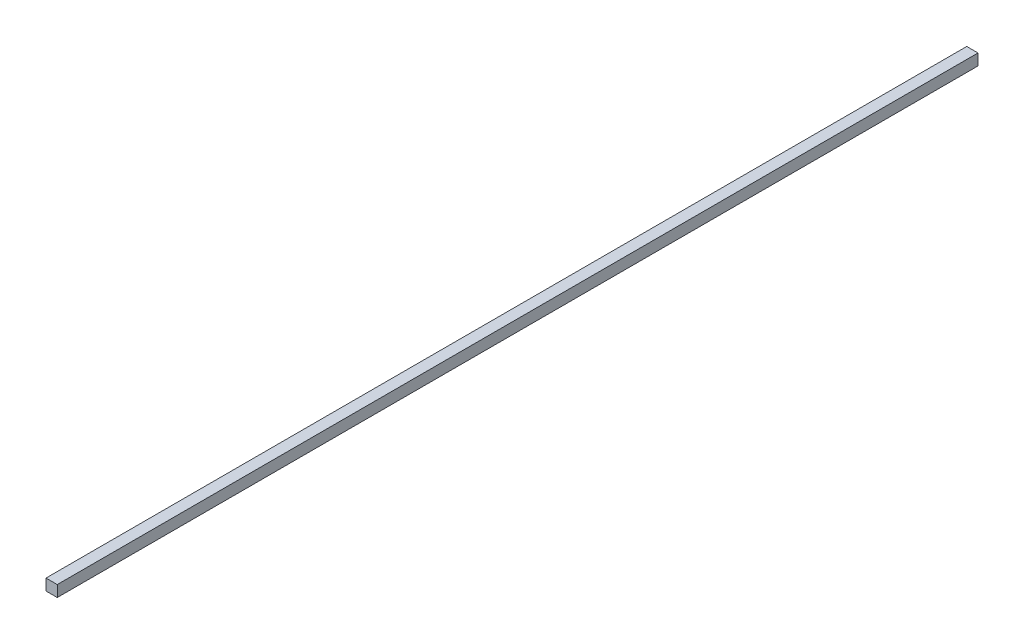
ISO-10303-21;
HEADER;
FILE_DESCRIPTION(('STEP AP214'),'2;1');
FILE_NAME('part.step','',(''),(''),'','','');
FILE_SCHEMA(('AUTOMOTIVE_DESIGN { 1 0 10303 214 1 1 1 1 }'));
ENDSEC;
DATA;
#1=APPLICATION_CONTEXT('core data for automotive mechanical design processes');
#2=APPLICATION_PROTOCOL_DEFINITION('international standard','automotive_design',2000,#1);
#3=PRODUCT_CONTEXT('',#1,'mechanical');
#4=PRODUCT('Part','Part','',(#3));
#5=PRODUCT_RELATED_PRODUCT_CATEGORY('part','',(#4));
#6=PRODUCT_DEFINITION_FORMATION('','',#4);
#7=PRODUCT_DEFINITION_CONTEXT('part definition',#1,'design');
#8=PRODUCT_DEFINITION('design','',#6,#7);
#9=PRODUCT_DEFINITION_SHAPE('','',#8);
#10=(LENGTH_UNIT() NAMED_UNIT(*) SI_UNIT(.MILLI.,.METRE.));
#11=(NAMED_UNIT(*) PLANE_ANGLE_UNIT() SI_UNIT($,.RADIAN.));
#12=(NAMED_UNIT(*) SI_UNIT($,.STERADIAN.) SOLID_ANGLE_UNIT());
#13=UNCERTAINTY_MEASURE_WITH_UNIT(LENGTH_MEASURE(1.E-05),#10,'distance_accuracy_value','');
#14=(GEOMETRIC_REPRESENTATION_CONTEXT(3) GLOBAL_UNCERTAINTY_ASSIGNED_CONTEXT((#13)) GLOBAL_UNIT_ASSIGNED_CONTEXT((#10,
#11,#12)) REPRESENTATION_CONTEXT('',''));
#15=CARTESIAN_POINT('',(0.,0.,0.));
#16=DIRECTION('',(0.,0.,1.));
#17=DIRECTION('',(1.,0.,0.));
#18=AXIS2_PLACEMENT_3D('',#15,#16,#17);
#19=CARTESIAN_POINT('',(6.35,0.,0.));
#20=DIRECTION('',(-1.,0.,0.));
#21=DIRECTION('',(0.,0.,1.));
#22=AXIS2_PLACEMENT_3D('',#19,#20,#21);
#23=PLANE('',#22);
#24=DIRECTION('',(0.,0.,1.));
#25=VECTOR('',#24,1.);
#26=CARTESIAN_POINT('',(6.35,6.35,259.75));
#27=LINE('',#26,#25);
#28=CARTESIAN_POINT('',(6.35,6.35,0.));
#29=VERTEX_POINT('',#28);
#30=CARTESIAN_POINT('',(6.35,6.35,519.5));
#31=VERTEX_POINT('',#30);
#32=EDGE_CURVE('E21',#29,#31,#27,.T.);
#33=ORIENTED_EDGE('',*,*,#32,.T.);
#34=DIRECTION('',(0.,-1.,0.));
#35=VECTOR('',#34,1.);
#36=CARTESIAN_POINT('',(6.35,3.175,519.5));
#37=LINE('',#36,#35);
#38=CARTESIAN_POINT('',(6.35,0.,519.5));
#39=VERTEX_POINT('',#38);
#40=EDGE_CURVE('E56',#31,#39,#37,.T.);
#41=ORIENTED_EDGE('',*,*,#40,.T.);
#42=DIRECTION('',(0.,0.,-1.));
#43=VECTOR('',#42,1.);
#44=CARTESIAN_POINT('',(6.35,0.,259.75));
#45=LINE('',#44,#43);
#46=CARTESIAN_POINT('',(6.35,0.,0.));
#47=VERTEX_POINT('',#46);
#48=EDGE_CURVE('E77',#39,#47,#45,.T.);
#49=ORIENTED_EDGE('',*,*,#48,.T.);
#50=DIRECTION('',(0.,-1.,0.));
#51=VECTOR('',#50,1.);
#52=CARTESIAN_POINT('',(6.35,3.175,0.));
#53=LINE('',#52,#51);
#54=EDGE_CURVE('E59',#29,#47,#53,.T.);
#55=ORIENTED_EDGE('',*,*,#54,.F.);
#56=EDGE_LOOP('',(#33,#41,#49,#55));
#57=FACE_BOUND('',#56,.T.);
#58=ADVANCED_FACE('F17',(#57),#23,.F.);
#59=CARTESIAN_POINT('',(0.,6.35,519.5));
#60=DIRECTION('',(0.,-1.,0.));
#61=DIRECTION('',(0.,0.,-1.));
#62=AXIS2_PLACEMENT_3D('',#59,#60,#61);
#63=PLANE('',#62);
#64=DIRECTION('',(0.,0.,1.));
#65=VECTOR('',#64,1.);
#66=CARTESIAN_POINT('',(0.,6.35,259.75));
#67=LINE('',#66,#65);
#68=CARTESIAN_POINT('',(0.,6.35,0.));
#69=VERTEX_POINT('',#68);
#70=CARTESIAN_POINT('',(0.,6.35,519.5));
#71=VERTEX_POINT('',#70);
#72=EDGE_CURVE('E74',#69,#71,#67,.T.);
#73=ORIENTED_EDGE('',*,*,#72,.T.);
#74=DIRECTION('',(1.,0.,0.));
#75=VECTOR('',#74,1.);
#76=CARTESIAN_POINT('',(3.175,6.35,519.5));
#77=LINE('',#76,#75);
#78=EDGE_CURVE('E64',#71,#31,#77,.T.);
#79=ORIENTED_EDGE('',*,*,#78,.T.);
#80=ORIENTED_EDGE('',*,*,#32,.F.);
#81=DIRECTION('',(1.,0.,0.));
#82=VECTOR('',#81,1.);
#83=CARTESIAN_POINT('',(3.175,6.35,0.));
#84=LINE('',#83,#82);
#85=EDGE_CURVE('E79',#69,#29,#84,.T.);
#86=ORIENTED_EDGE('',*,*,#85,.F.);
#87=EDGE_LOOP('',(#73,#79,#80,#86));
#88=FACE_BOUND('',#87,.T.);
#89=ADVANCED_FACE('F73',(#88),#63,.F.);
#90=CARTESIAN_POINT('',(6.35,0.,519.5));
#91=DIRECTION('',(0.,0.,-1.));
#92=DIRECTION('',(-1.,0.,0.));
#93=AXIS2_PLACEMENT_3D('',#90,#91,#92);
#94=PLANE('',#93);
#95=DIRECTION('',(1.,0.,0.));
#96=VECTOR('',#95,1.);
#97=CARTESIAN_POINT('',(3.175,0.,519.5));
#98=LINE('',#97,#96);
#99=CARTESIAN_POINT('',(0.,0.,519.5));
#100=VERTEX_POINT('',#99);
#101=EDGE_CURVE('E70',#100,#39,#98,.T.);
#102=ORIENTED_EDGE('',*,*,#101,.T.);
#103=ORIENTED_EDGE('',*,*,#40,.F.);
#104=ORIENTED_EDGE('',*,*,#78,.F.);
#105=DIRECTION('',(0.,-1.,0.));
#106=VECTOR('',#105,1.);
#107=CARTESIAN_POINT('',(0.,3.175,519.5));
#108=LINE('',#107,#106);
#109=EDGE_CURVE('E84',#71,#100,#108,.T.);
#110=ORIENTED_EDGE('',*,*,#109,.T.);
#111=EDGE_LOOP('',(#102,#103,#104,#110));
#112=FACE_BOUND('',#111,.T.);
#113=ADVANCED_FACE('F67',(#112),#94,.F.);
#114=CARTESIAN_POINT('',(0.,0.,0.));
#115=DIRECTION('',(0.,1.,0.));
#116=DIRECTION('',(0.,0.,1.));
#117=AXIS2_PLACEMENT_3D('',#114,#115,#116);
#118=PLANE('',#117);
#119=ORIENTED_EDGE('',*,*,#48,.F.);
#120=ORIENTED_EDGE('',*,*,#101,.F.);
#121=DIRECTION('',(0.,0.,-1.));
#122=VECTOR('',#121,1.);
#123=CARTESIAN_POINT('',(0.,0.,259.75));
#124=LINE('',#123,#122);
#125=CARTESIAN_POINT('',(0.,0.,0.));
#126=VERTEX_POINT('',#125);
#127=EDGE_CURVE('E27',#100,#126,#124,.T.);
#128=ORIENTED_EDGE('',*,*,#127,.T.);
#129=DIRECTION('',(-1.,0.,0.));
#130=VECTOR('',#129,1.);
#131=CARTESIAN_POINT('',(3.175,0.,0.));
#132=LINE('',#131,#130);
#133=EDGE_CURVE('E35',#47,#126,#132,.T.);
#134=ORIENTED_EDGE('',*,*,#133,.F.);
#135=EDGE_LOOP('',(#119,#120,#128,#134));
#136=FACE_BOUND('',#135,.T.);
#137=ADVANCED_FACE('F89',(#136),#118,.F.);
#138=CARTESIAN_POINT('',(6.35,0.,0.));
#139=DIRECTION('',(0.,0.,-1.));
#140=DIRECTION('',(-1.,0.,0.));
#141=AXIS2_PLACEMENT_3D('',#138,#139,#140);
#142=PLANE('',#141);
#143=ORIENTED_EDGE('',*,*,#54,.T.);
#144=ORIENTED_EDGE('',*,*,#133,.T.);
#145=DIRECTION('',(0.,1.,0.));
#146=VECTOR('',#145,1.);
#147=CARTESIAN_POINT('',(0.,3.175,0.));
#148=LINE('',#147,#146);
#149=EDGE_CURVE('E11',#126,#69,#148,.T.);
#150=ORIENTED_EDGE('',*,*,#149,.T.);
#151=ORIENTED_EDGE('',*,*,#85,.T.);
#152=EDGE_LOOP('',(#143,#144,#150,#151));
#153=FACE_BOUND('',#152,.T.);
#154=ADVANCED_FACE('F91',(#153),#142,.T.);
#155=CARTESIAN_POINT('',(0.,0.,519.5));
#156=DIRECTION('',(1.,0.,0.));
#157=DIRECTION('',(0.,0.,-1.));
#158=AXIS2_PLACEMENT_3D('',#155,#156,#157);
#159=PLANE('',#158);
#160=ORIENTED_EDGE('',*,*,#127,.F.);
#161=ORIENTED_EDGE('',*,*,#109,.F.);
#162=ORIENTED_EDGE('',*,*,#72,.F.);
#163=ORIENTED_EDGE('',*,*,#149,.F.);
#164=EDGE_LOOP('',(#160,#161,#162,#163));
#165=FACE_BOUND('',#164,.T.);
#166=ADVANCED_FACE('F19',(#165),#159,.F.);
#167=CLOSED_SHELL('',(#58,#89,#113,#137,#154,#166));
#168=MANIFOLD_SOLID_BREP('B1',#167);
#169=ADVANCED_BREP_SHAPE_REPRESENTATION('',(#18,#168),#14);
#170=SHAPE_DEFINITION_REPRESENTATION(#9,#169);
ENDSEC;
END-ISO-10303-21;
